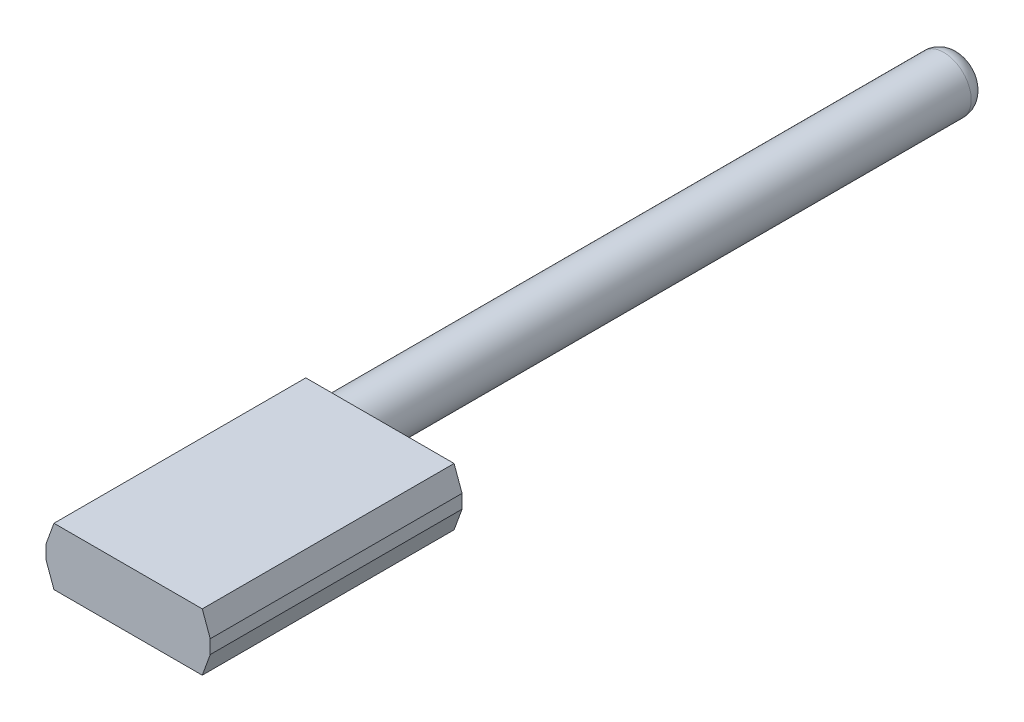
ISO-10303-21;
HEADER;
FILE_DESCRIPTION(('STEP AP214'),'2;1');
FILE_NAME('part.step','',(''),(''),'','','');
FILE_SCHEMA(('AUTOMOTIVE_DESIGN { 1 0 10303 214 1 1 1 1 }'));
ENDSEC;
DATA;
#1=APPLICATION_CONTEXT('core data for automotive mechanical design processes');
#2=APPLICATION_PROTOCOL_DEFINITION('international standard','automotive_design',2000,#1);
#3=PRODUCT_CONTEXT('',#1,'mechanical');
#4=PRODUCT('Part','Part','',(#3));
#5=PRODUCT_RELATED_PRODUCT_CATEGORY('part','',(#4));
#6=PRODUCT_DEFINITION_FORMATION('','',#4);
#7=PRODUCT_DEFINITION_CONTEXT('part definition',#1,'design');
#8=PRODUCT_DEFINITION('design','',#6,#7);
#9=PRODUCT_DEFINITION_SHAPE('','',#8);
#10=(LENGTH_UNIT() NAMED_UNIT(*) SI_UNIT(.MILLI.,.METRE.));
#11=(NAMED_UNIT(*) PLANE_ANGLE_UNIT() SI_UNIT($,.RADIAN.));
#12=(NAMED_UNIT(*) SI_UNIT($,.STERADIAN.) SOLID_ANGLE_UNIT());
#13=UNCERTAINTY_MEASURE_WITH_UNIT(LENGTH_MEASURE(1.E-05),#10,'distance_accuracy_value','');
#14=(GEOMETRIC_REPRESENTATION_CONTEXT(3) GLOBAL_UNCERTAINTY_ASSIGNED_CONTEXT((#13)) GLOBAL_UNIT_ASSIGNED_CONTEXT((#10,
#11,#12)) REPRESENTATION_CONTEXT('',''));
#15=CARTESIAN_POINT('',(0.,0.,0.));
#16=DIRECTION('',(0.,0.,1.));
#17=DIRECTION('',(1.,0.,0.));
#18=AXIS2_PLACEMENT_3D('',#15,#16,#17);
#19=CARTESIAN_POINT('',(-15.,-1.25,46.));
#20=DIRECTION('',(1.,0.,0.));
#21=DIRECTION('',(0.,0.,-1.));
#22=AXIS2_PLACEMENT_3D('',#19,#20,#21);
#23=PLANE('',#22);
#24=DIRECTION('',(0.,-1.,0.));
#25=VECTOR('',#24,1.);
#26=CARTESIAN_POINT('',(-15.,-1.25,0.));
#27=LINE('',#26,#25);
#28=CARTESIAN_POINT('',(-15.,1.25,0.));
#29=VERTEX_POINT('',#28);
#30=CARTESIAN_POINT('',(-15.,-1.25,0.));
#31=VERTEX_POINT('',#30);
#32=EDGE_CURVE('E144',#29,#31,#27,.T.);
#33=ORIENTED_EDGE('',*,*,#32,.T.);
#34=DIRECTION('',(0.,0.,-1.));
#35=VECTOR('',#34,1.);
#36=CARTESIAN_POINT('',(-15.,-1.25,46.));
#37=LINE('',#36,#35);
#38=CARTESIAN_POINT('',(-15.,-1.25,46.));
#39=VERTEX_POINT('',#38);
#40=EDGE_CURVE('E186',#39,#31,#37,.T.);
#41=ORIENTED_EDGE('',*,*,#40,.F.);
#42=DIRECTION('',(0.,-1.,0.));
#43=VECTOR('',#42,1.);
#44=CARTESIAN_POINT('',(-15.,-1.25,46.));
#45=LINE('',#44,#43);
#46=CARTESIAN_POINT('',(-15.,1.25,46.));
#47=VERTEX_POINT('',#46);
#48=EDGE_CURVE('E167',#47,#39,#45,.T.);
#49=ORIENTED_EDGE('',*,*,#48,.F.);
#50=DIRECTION('',(0.,0.,-1.));
#51=VECTOR('',#50,1.);
#52=CARTESIAN_POINT('',(-15.,1.25,46.));
#53=LINE('',#52,#51);
#54=EDGE_CURVE('E140',#47,#29,#53,.T.);
#55=ORIENTED_EDGE('',*,*,#54,.T.);
#56=EDGE_LOOP('',(#33,#41,#49,#55));
#57=FACE_BOUND('',#56,.T.);
#58=ADVANCED_FACE('F41',(#57),#23,.F.);
#59=CARTESIAN_POINT('',(-13.5441190629352,-5.25,46.));
#60=DIRECTION('',(0.939692620785908,0.342020143325669,0.));
#61=DIRECTION('',(-0.342020143325669,0.939692620785909,0.));
#62=AXIS2_PLACEMENT_3D('',#59,#60,#61);
#63=PLANE('',#62);
#64=DIRECTION('',(0.342020143325669,-0.939692620785908,0.));
#65=VECTOR('',#64,1.);
#66=CARTESIAN_POINT('',(-13.5441190629352,-5.25,0.));
#67=LINE('',#66,#65);
#68=CARTESIAN_POINT('',(-13.5441190629352,-5.25,0.));
#69=VERTEX_POINT('',#68);
#70=EDGE_CURVE('E148',#31,#69,#67,.T.);
#71=ORIENTED_EDGE('',*,*,#70,.T.);
#72=DIRECTION('',(0.,0.,-1.));
#73=VECTOR('',#72,1.);
#74=CARTESIAN_POINT('',(-13.5441190629352,-5.25,46.));
#75=LINE('',#74,#73);
#76=CARTESIAN_POINT('',(-13.5441190629352,-5.25,46.));
#77=VERTEX_POINT('',#76);
#78=EDGE_CURVE('E182',#77,#69,#75,.T.);
#79=ORIENTED_EDGE('',*,*,#78,.F.);
#80=DIRECTION('',(0.342020143325669,-0.939692620785908,0.));
#81=VECTOR('',#80,1.);
#82=CARTESIAN_POINT('',(-13.5441190629352,-5.25,46.));
#83=LINE('',#82,#81);
#84=EDGE_CURVE('E103',#39,#77,#83,.T.);
#85=ORIENTED_EDGE('',*,*,#84,.F.);
#86=ORIENTED_EDGE('',*,*,#40,.T.);
#87=EDGE_LOOP('',(#71,#79,#85,#86));
#88=FACE_BOUND('',#87,.T.);
#89=ADVANCED_FACE('F203',(#88),#63,.F.);
#90=CARTESIAN_POINT('',(-13.5441190629352,-5.25,46.));
#91=DIRECTION('',(0.,1.,0.));
#92=DIRECTION('',(0.,0.,1.));
#93=AXIS2_PLACEMENT_3D('',#90,#91,#92);
#94=PLANE('',#93);
#95=DIRECTION('',(1.,0.,0.));
#96=VECTOR('',#95,1.);
#97=CARTESIAN_POINT('',(-13.5441190629352,-5.25,0.));
#98=LINE('',#97,#96);
#99=CARTESIAN_POINT('',(13.5441190629352,-5.25,0.));
#100=VERTEX_POINT('',#99);
#101=EDGE_CURVE('E152',#69,#100,#98,.T.);
#102=ORIENTED_EDGE('',*,*,#101,.T.);
#103=DIRECTION('',(0.,0.,-1.));
#104=VECTOR('',#103,1.);
#105=CARTESIAN_POINT('',(13.5441190629352,-5.25,46.));
#106=LINE('',#105,#104);
#107=CARTESIAN_POINT('',(13.5441190629352,-5.25,46.));
#108=VERTEX_POINT('',#107);
#109=EDGE_CURVE('E178',#108,#100,#106,.T.);
#110=ORIENTED_EDGE('',*,*,#109,.F.);
#111=DIRECTION('',(1.,0.,0.));
#112=VECTOR('',#111,1.);
#113=CARTESIAN_POINT('',(-13.5441190629352,-5.25,46.));
#114=LINE('',#113,#112);
#115=EDGE_CURVE('E249',#77,#108,#114,.T.);
#116=ORIENTED_EDGE('',*,*,#115,.F.);
#117=ORIENTED_EDGE('',*,*,#78,.T.);
#118=EDGE_LOOP('',(#102,#110,#116,#117));
#119=FACE_BOUND('',#118,.T.);
#120=ADVANCED_FACE('F208',(#119),#94,.F.);
#121=CARTESIAN_POINT('',(13.5441190629352,-5.25,46.));
#122=DIRECTION('',(-0.939692620785908,0.342020143325669,0.));
#123=DIRECTION('',(-0.342020143325669,-0.939692620785909,0.));
#124=AXIS2_PLACEMENT_3D('',#121,#122,#123);
#125=PLANE('',#124);
#126=DIRECTION('',(0.342020143325669,0.939692620785908,0.));
#127=VECTOR('',#126,1.);
#128=CARTESIAN_POINT('',(13.5441190629352,-5.25,0.));
#129=LINE('',#128,#127);
#130=CARTESIAN_POINT('',(15.,-1.25,0.));
#131=VERTEX_POINT('',#130);
#132=EDGE_CURVE('E155',#100,#131,#129,.T.);
#133=ORIENTED_EDGE('',*,*,#132,.T.);
#134=DIRECTION('',(0.,0.,-1.));
#135=VECTOR('',#134,1.);
#136=CARTESIAN_POINT('',(15.,-1.25,46.));
#137=LINE('',#136,#135);
#138=CARTESIAN_POINT('',(15.,-1.25,46.));
#139=VERTEX_POINT('',#138);
#140=EDGE_CURVE('E174',#139,#131,#137,.T.);
#141=ORIENTED_EDGE('',*,*,#140,.F.);
#142=DIRECTION('',(0.342020143325669,0.939692620785908,0.));
#143=VECTOR('',#142,1.);
#144=CARTESIAN_POINT('',(13.5441190629352,-5.25,46.));
#145=LINE('',#144,#143);
#146=EDGE_CURVE('E252',#108,#139,#145,.T.);
#147=ORIENTED_EDGE('',*,*,#146,.F.);
#148=ORIENTED_EDGE('',*,*,#109,.T.);
#149=EDGE_LOOP('',(#133,#141,#147,#148));
#150=FACE_BOUND('',#149,.T.);
#151=ADVANCED_FACE('F213',(#150),#125,.F.);
#152=CARTESIAN_POINT('',(15.,-1.25,46.));
#153=DIRECTION('',(-1.,0.,0.));
#154=DIRECTION('',(0.,0.,1.));
#155=AXIS2_PLACEMENT_3D('',#152,#153,#154);
#156=PLANE('',#155);
#157=DIRECTION('',(0.,1.,0.));
#158=VECTOR('',#157,1.);
#159=CARTESIAN_POINT('',(15.,-1.25,0.));
#160=LINE('',#159,#158);
#161=CARTESIAN_POINT('',(15.,1.25,0.));
#162=VERTEX_POINT('',#161);
#163=EDGE_CURVE('E158',#131,#162,#160,.T.);
#164=ORIENTED_EDGE('',*,*,#163,.T.);
#165=DIRECTION('',(0.,0.,-1.));
#166=VECTOR('',#165,1.);
#167=CARTESIAN_POINT('',(15.,1.25,46.));
#168=LINE('',#167,#166);
#169=CARTESIAN_POINT('',(15.,1.25,46.));
#170=VERTEX_POINT('',#169);
#171=EDGE_CURVE('E133',#170,#162,#168,.T.);
#172=ORIENTED_EDGE('',*,*,#171,.F.);
#173=DIRECTION('',(0.,1.,0.));
#174=VECTOR('',#173,1.);
#175=CARTESIAN_POINT('',(15.,-1.25,46.));
#176=LINE('',#175,#174);
#177=EDGE_CURVE('E122',#139,#170,#176,.T.);
#178=ORIENTED_EDGE('',*,*,#177,.F.);
#179=ORIENTED_EDGE('',*,*,#140,.T.);
#180=EDGE_LOOP('',(#164,#172,#178,#179));
#181=FACE_BOUND('',#180,.T.);
#182=ADVANCED_FACE('F217',(#181),#156,.F.);
#183=CARTESIAN_POINT('',(15.,1.25,46.));
#184=DIRECTION('',(-0.939692620785908,-0.342020143325669,0.));
#185=DIRECTION('',(0.342020143325669,-0.939692620785909,0.));
#186=AXIS2_PLACEMENT_3D('',#183,#184,#185);
#187=PLANE('',#186);
#188=DIRECTION('',(-0.342020143325669,0.939692620785908,0.));
#189=VECTOR('',#188,1.);
#190=CARTESIAN_POINT('',(15.,1.25,0.));
#191=LINE('',#190,#189);
#192=CARTESIAN_POINT('',(13.5441190629352,5.25,0.));
#193=VERTEX_POINT('',#192);
#194=EDGE_CURVE('E131',#162,#193,#191,.T.);
#195=ORIENTED_EDGE('',*,*,#194,.T.);
#196=DIRECTION('',(0.,0.,-1.));
#197=VECTOR('',#196,1.);
#198=CARTESIAN_POINT('',(13.5441190629352,5.25,46.));
#199=LINE('',#198,#197);
#200=CARTESIAN_POINT('',(13.5441190629352,5.25,46.));
#201=VERTEX_POINT('',#200);
#202=EDGE_CURVE('E128',#201,#193,#199,.T.);
#203=ORIENTED_EDGE('',*,*,#202,.F.);
#204=DIRECTION('',(-0.342020143325669,0.939692620785908,0.));
#205=VECTOR('',#204,1.);
#206=CARTESIAN_POINT('',(15.,1.25,46.));
#207=LINE('',#206,#205);
#208=EDGE_CURVE('E116',#170,#201,#207,.T.);
#209=ORIENTED_EDGE('',*,*,#208,.F.);
#210=ORIENTED_EDGE('',*,*,#171,.T.);
#211=EDGE_LOOP('',(#195,#203,#209,#210));
#212=FACE_BOUND('',#211,.T.);
#213=ADVANCED_FACE('F129',(#212),#187,.F.);
#214=CARTESIAN_POINT('',(-13.5441190629352,5.25,46.));
#215=DIRECTION('',(0.,-1.,0.));
#216=DIRECTION('',(1.,0.,0.));
#217=AXIS2_PLACEMENT_3D('',#214,#215,#216);
#218=PLANE('',#217);
#219=DIRECTION('',(-1.,0.,0.));
#220=VECTOR('',#219,1.);
#221=CARTESIAN_POINT('',(-13.5441190629352,5.25,0.));
#222=LINE('',#221,#220);
#223=CARTESIAN_POINT('',(-13.5441190629352,5.25,0.));
#224=VERTEX_POINT('',#223);
#225=EDGE_CURVE('E88',#193,#224,#222,.T.);
#226=ORIENTED_EDGE('',*,*,#225,.T.);
#227=DIRECTION('',(0.,0.,-1.));
#228=VECTOR('',#227,1.);
#229=CARTESIAN_POINT('',(-13.5441190629352,5.25,46.));
#230=LINE('',#229,#228);
#231=CARTESIAN_POINT('',(-13.5441190629352,5.25,46.));
#232=VERTEX_POINT('',#231);
#233=EDGE_CURVE('E134',#232,#224,#230,.T.);
#234=ORIENTED_EDGE('',*,*,#233,.F.);
#235=DIRECTION('',(-1.,0.,0.));
#236=VECTOR('',#235,1.);
#237=CARTESIAN_POINT('',(-13.5441190629352,5.25,46.));
#238=LINE('',#237,#236);
#239=EDGE_CURVE('E120',#201,#232,#238,.T.);
#240=ORIENTED_EDGE('',*,*,#239,.F.);
#241=ORIENTED_EDGE('',*,*,#202,.T.);
#242=EDGE_LOOP('',(#226,#234,#240,#241));
#243=FACE_BOUND('',#242,.T.);
#244=ADVANCED_FACE('F136',(#243),#218,.F.);
#245=CARTESIAN_POINT('',(-15.,1.25,46.));
#246=DIRECTION('',(0.939692620785908,-0.342020143325669,0.));
#247=DIRECTION('',(0.342020143325669,0.939692620785909,0.));
#248=AXIS2_PLACEMENT_3D('',#245,#246,#247);
#249=PLANE('',#248);
#250=DIRECTION('',(-0.342020143325669,-0.939692620785908,0.));
#251=VECTOR('',#250,1.);
#252=CARTESIAN_POINT('',(-15.,1.25,0.));
#253=LINE('',#252,#251);
#254=EDGE_CURVE('E94',#224,#29,#253,.T.);
#255=ORIENTED_EDGE('',*,*,#254,.T.);
#256=ORIENTED_EDGE('',*,*,#54,.F.);
#257=DIRECTION('',(-0.342020143325669,-0.939692620785908,0.));
#258=VECTOR('',#257,1.);
#259=CARTESIAN_POINT('',(-15.,1.25,46.));
#260=LINE('',#259,#258);
#261=EDGE_CURVE('E59',#232,#47,#260,.T.);
#262=ORIENTED_EDGE('',*,*,#261,.F.);
#263=ORIENTED_EDGE('',*,*,#233,.T.);
#264=EDGE_LOOP('',(#255,#256,#262,#263));
#265=FACE_BOUND('',#264,.T.);
#266=ADVANCED_FACE('F226',(#265),#249,.F.);
#267=CARTESIAN_POINT('',(0.,0.,46.));
#268=DIRECTION('',(0.,0.,-1.));
#269=DIRECTION('',(-1.,0.,0.));
#270=AXIS2_PLACEMENT_3D('',#267,#268,#269);
#271=PLANE('',#270);
#272=ORIENTED_EDGE('',*,*,#48,.T.);
#273=ORIENTED_EDGE('',*,*,#84,.T.);
#274=ORIENTED_EDGE('',*,*,#115,.T.);
#275=ORIENTED_EDGE('',*,*,#146,.T.);
#276=ORIENTED_EDGE('',*,*,#177,.T.);
#277=ORIENTED_EDGE('',*,*,#208,.T.);
#278=ORIENTED_EDGE('',*,*,#239,.T.);
#279=ORIENTED_EDGE('',*,*,#261,.T.);
#280=EDGE_LOOP('',(#272,#273,#274,#275,#276,#277,#278,#279));
#281=FACE_BOUND('',#280,.T.);
#282=ADVANCED_FACE('F118',(#281),#271,.F.);
#283=CARTESIAN_POINT('',(0.,0.,0.));
#284=DIRECTION('',(0.,0.,-1.));
#285=DIRECTION('',(-1.,0.,0.));
#286=AXIS2_PLACEMENT_3D('',#283,#284,#285);
#287=PLANE('',#286);
#288=CARTESIAN_POINT('',(-7.,0.,0.));
#289=DIRECTION('',(0.,0.,-1.));
#290=DIRECTION('',(-1.,0.,0.));
#291=AXIS2_PLACEMENT_3D('',#288,#289,#290);
#292=CIRCLE('',#291,5.);
#293=CARTESIAN_POINT('',(-12.,0.,0.));
#294=VERTEX_POINT('',#293);
#295=EDGE_CURVE('E149',#294,#294,#292,.T.);
#296=ORIENTED_EDGE('',*,*,#295,.F.);
#297=EDGE_LOOP('',(#296));
#298=FACE_BOUND('',#297,.T.);
#299=ORIENTED_EDGE('',*,*,#32,.F.);
#300=ORIENTED_EDGE('',*,*,#254,.F.);
#301=ORIENTED_EDGE('',*,*,#225,.F.);
#302=ORIENTED_EDGE('',*,*,#194,.F.);
#303=ORIENTED_EDGE('',*,*,#163,.F.);
#304=ORIENTED_EDGE('',*,*,#132,.F.);
#305=ORIENTED_EDGE('',*,*,#101,.F.);
#306=ORIENTED_EDGE('',*,*,#70,.F.);
#307=EDGE_LOOP('',(#299,#300,#301,#302,#303,#304,#305,#306));
#308=FACE_BOUND('',#307,.T.);
#309=ADVANCED_FACE('F229',(#298,#308),#287,.T.);
#310=CARTESIAN_POINT('',(-7.,0.,-113.));
#311=DIRECTION('',(0.,0.,1.));
#312=DIRECTION('',(1.,0.,0.));
#313=AXIS2_PLACEMENT_3D('',#310,#311,#312);
#314=CYLINDRICAL_SURFACE('',#313,5.);
#315=CARTESIAN_POINT('',(-7.,0.,-110.));
#316=DIRECTION('',(0.,0.,-1.));
#317=DIRECTION('',(-1.,0.,0.));
#318=AXIS2_PLACEMENT_3D('',#315,#316,#317);
#319=CIRCLE('',#318,5.);
#320=CARTESIAN_POINT('',(-12.,0.,-110.));
#321=VERTEX_POINT('',#320);
#322=EDGE_CURVE('E11',#321,#321,#319,.F.);
#323=ORIENTED_EDGE('',*,*,#322,.T.);
#324=EDGE_LOOP('',(#323));
#325=FACE_BOUND('',#324,.T.);
#326=ORIENTED_EDGE('',*,*,#295,.T.);
#327=EDGE_LOOP('',(#326));
#328=FACE_BOUND('',#327,.T.);
#329=ADVANCED_FACE('F199',(#325,#328),#314,.T.);
#330=CARTESIAN_POINT('',(-7.,0.,-113.));
#331=DIRECTION('',(0.,0.,-1.));
#332=DIRECTION('',(-1.,0.,0.));
#333=AXIS2_PLACEMENT_3D('',#330,#331,#332);
#334=PLANE('',#333);
#335=CARTESIAN_POINT('',(-7.,0.,-113.));
#336=DIRECTION('',(0.,0.,-1.));
#337=DIRECTION('',(-1.,0.,0.));
#338=AXIS2_PLACEMENT_3D('',#335,#336,#337);
#339=CIRCLE('',#338,2.);
#340=CARTESIAN_POINT('',(-9.,0.,-113.));
#341=VERTEX_POINT('',#340);
#342=EDGE_CURVE('E51',#341,#341,#339,.T.);
#343=ORIENTED_EDGE('',*,*,#342,.T.);
#344=EDGE_LOOP('',(#343));
#345=FACE_BOUND('',#344,.T.);
#346=ADVANCED_FACE('F192',(#345),#334,.T.);
#347=CARTESIAN_POINT('',(-7.,0.,-110.));
#348=DIRECTION('',(0.,0.,-1.));
#349=DIRECTION('',(-1.,0.,0.));
#350=AXIS2_PLACEMENT_3D('',#347,#348,#349);
#351=DEGENERATE_TOROIDAL_SURFACE('',#350,2.,3.,.T.);
#352=ORIENTED_EDGE('',*,*,#322,.F.);
#353=EDGE_LOOP('',(#352));
#354=FACE_BOUND('',#353,.T.);
#355=ORIENTED_EDGE('',*,*,#342,.F.);
#356=EDGE_LOOP('',(#355));
#357=FACE_BOUND('',#356,.T.);
#358=ADVANCED_FACE('F43',(#354,#357),#351,.T.);
#359=CLOSED_SHELL('',(#58,#89,#120,#151,#182,#213,#244,#266,#282,#309,#329,#346,#358));
#360=MANIFOLD_SOLID_BREP('B2',#359);
#361=ADVANCED_BREP_SHAPE_REPRESENTATION('',(#18,#360),#14);
#362=SHAPE_DEFINITION_REPRESENTATION(#9,#361);
ENDSEC;
END-ISO-10303-21;
